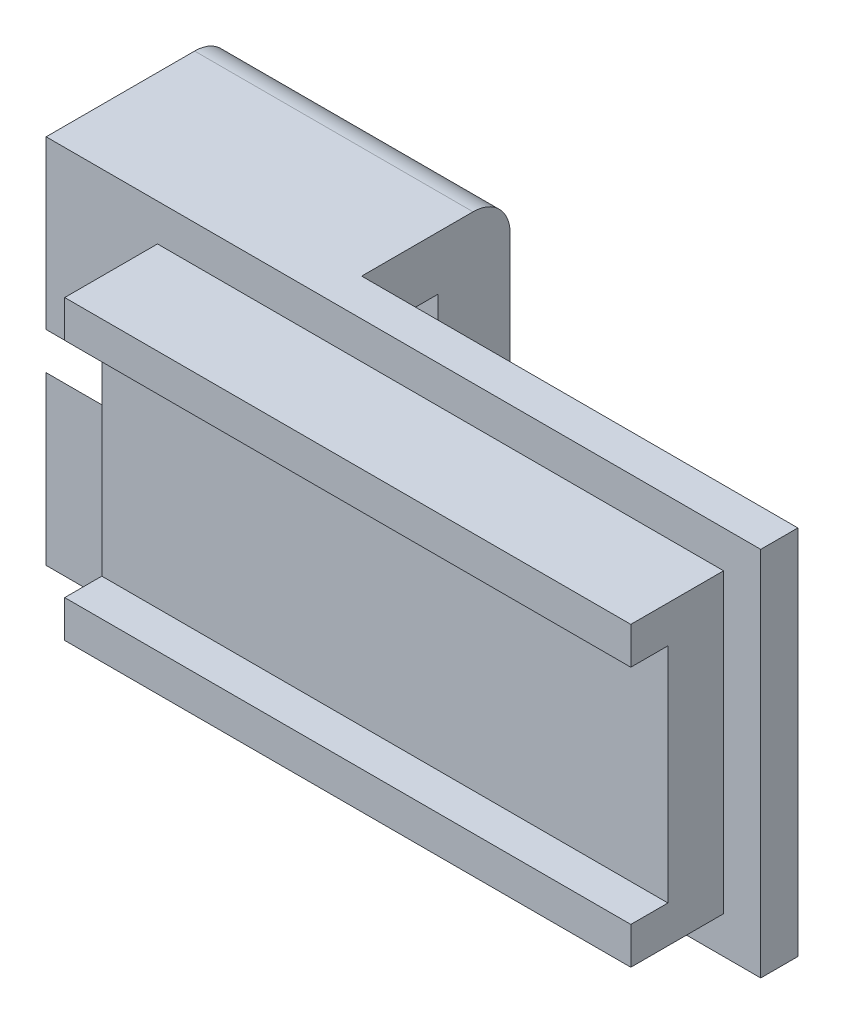
ISO-10303-21;
HEADER;
FILE_DESCRIPTION(('STEP AP214'),'2;1');
FILE_NAME('part.step','',(''),(''),'','','');
FILE_SCHEMA(('AUTOMOTIVE_DESIGN { 1 0 10303 214 1 1 1 1 }'));
ENDSEC;
DATA;
#1=APPLICATION_CONTEXT('core data for automotive mechanical design processes');
#2=APPLICATION_PROTOCOL_DEFINITION('international standard','automotive_design',2000,#1);
#3=PRODUCT_CONTEXT('',#1,'mechanical');
#4=PRODUCT('Part','Part','',(#3));
#5=PRODUCT_RELATED_PRODUCT_CATEGORY('part','',(#4));
#6=PRODUCT_DEFINITION_FORMATION('','',#4);
#7=PRODUCT_DEFINITION_CONTEXT('part definition',#1,'design');
#8=PRODUCT_DEFINITION('design','',#6,#7);
#9=PRODUCT_DEFINITION_SHAPE('','',#8);
#10=(LENGTH_UNIT() NAMED_UNIT(*) SI_UNIT(.MILLI.,.METRE.));
#11=(NAMED_UNIT(*) PLANE_ANGLE_UNIT() SI_UNIT($,.RADIAN.));
#12=(NAMED_UNIT(*) SI_UNIT($,.STERADIAN.) SOLID_ANGLE_UNIT());
#13=UNCERTAINTY_MEASURE_WITH_UNIT(LENGTH_MEASURE(1.E-05),#10,'distance_accuracy_value','');
#14=(GEOMETRIC_REPRESENTATION_CONTEXT(3) GLOBAL_UNCERTAINTY_ASSIGNED_CONTEXT((#13)) GLOBAL_UNIT_ASSIGNED_CONTEXT((#10,
#11,#12)) REPRESENTATION_CONTEXT('',''));
#15=CARTESIAN_POINT('',(0.,0.,0.));
#16=DIRECTION('',(0.,0.,1.));
#17=DIRECTION('',(1.,0.,0.));
#18=AXIS2_PLACEMENT_3D('',#15,#16,#17);
#19=CARTESIAN_POINT('',(0.,0.,7.99999999999998));
#20=DIRECTION('',(0.,0.,1.));
#21=DIRECTION('',(1.,0.,0.));
#22=AXIS2_PLACEMENT_3D('',#19,#20,#21);
#23=PLANE('',#22);
#24=DIRECTION('',(0.,-1.,0.));
#25=VECTOR('',#24,1.);
#26=CARTESIAN_POINT('',(6.,-8.,7.99999999999998));
#27=LINE('',#26,#25);
#28=CARTESIAN_POINT('',(6.,6.,7.99999999999998));
#29=VERTEX_POINT('',#28);
#30=CARTESIAN_POINT('',(6.,-6.,7.99999999999998));
#31=VERTEX_POINT('',#30);
#32=EDGE_CURVE('E428',#29,#31,#27,.T.);
#33=ORIENTED_EDGE('',*,*,#32,.T.);
#34=DIRECTION('',(1.,0.,0.));
#35=VECTOR('',#34,1.);
#36=CARTESIAN_POINT('',(6.,-6.,7.99999999999998));
#37=LINE('',#36,#35);
#38=CARTESIAN_POINT('',(36.5,-6.,7.99999999999998));
#39=VERTEX_POINT('',#38);
#40=EDGE_CURVE('E255',#31,#39,#37,.T.);
#41=ORIENTED_EDGE('',*,*,#40,.T.);
#42=DIRECTION('',(0.,1.,0.));
#43=VECTOR('',#42,1.);
#44=CARTESIAN_POINT('',(36.5,-7.99999999999999,7.99999999999998));
#45=LINE('',#44,#43);
#46=CARTESIAN_POINT('',(36.5,6.,7.99999999999998));
#47=VERTEX_POINT('',#46);
#48=EDGE_CURVE('E248',#39,#47,#45,.T.);
#49=ORIENTED_EDGE('',*,*,#48,.T.);
#50=DIRECTION('',(1.,0.,0.));
#51=VECTOR('',#50,1.);
#52=CARTESIAN_POINT('',(6.,6.,7.99999999999998));
#53=LINE('',#52,#51);
#54=EDGE_CURVE('E61',#29,#47,#53,.T.);
#55=ORIENTED_EDGE('',*,*,#54,.F.);
#56=EDGE_LOOP('',(#33,#41,#49,#55));
#57=FACE_BOUND('',#56,.T.);
#58=ADVANCED_FACE('F45',(#57),#23,.T.);
#59=CARTESIAN_POINT('',(38.5,0.,0.));
#60=DIRECTION('',(1.,0.,0.));
#61=DIRECTION('',(0.,0.,-1.));
#62=AXIS2_PLACEMENT_3D('',#59,#60,#61);
#63=PLANE('',#62);
#64=DIRECTION('',(0.,0.,-1.));
#65=VECTOR('',#64,1.);
#66=CARTESIAN_POINT('',(38.5,-10.,5.));
#67=LINE('',#66,#65);
#68=CARTESIAN_POINT('',(38.5,-10.,5.));
#69=VERTEX_POINT('',#68);
#70=CARTESIAN_POINT('',(38.5,-9.99999999999999,3.));
#71=VERTEX_POINT('',#70);
#72=EDGE_CURVE('E454',#69,#71,#67,.T.);
#73=ORIENTED_EDGE('',*,*,#72,.T.);
#74=DIRECTION('',(0.,-1.,0.));
#75=VECTOR('',#74,1.);
#76=CARTESIAN_POINT('',(38.5,-9.99999999999999,3.));
#77=LINE('',#76,#75);
#78=CARTESIAN_POINT('',(38.5,10.,3.));
#79=VERTEX_POINT('',#78);
#80=EDGE_CURVE('E385',#79,#71,#77,.T.);
#81=ORIENTED_EDGE('',*,*,#80,.F.);
#82=DIRECTION('',(0.,0.,1.));
#83=VECTOR('',#82,1.);
#84=CARTESIAN_POINT('',(38.5,10.,5.));
#85=LINE('',#84,#83);
#86=CARTESIAN_POINT('',(38.5,10.,5.));
#87=VERTEX_POINT('',#86);
#88=EDGE_CURVE('E447',#79,#87,#85,.T.);
#89=ORIENTED_EDGE('',*,*,#88,.T.);
#90=DIRECTION('',(0.,-1.,0.));
#91=VECTOR('',#90,1.);
#92=CARTESIAN_POINT('',(38.5,-10.,5.));
#93=LINE('',#92,#91);
#94=EDGE_CURVE('E450',#87,#69,#93,.T.);
#95=ORIENTED_EDGE('',*,*,#94,.T.);
#96=EDGE_LOOP('',(#73,#81,#89,#95));
#97=FACE_BOUND('',#96,.T.);
#98=ADVANCED_FACE('F549',(#97),#63,.T.);
#99=CARTESIAN_POINT('',(38.5,-10.,5.));
#100=DIRECTION('',(0.,0.,-1.));
#101=DIRECTION('',(-1.,0.,0.));
#102=AXIS2_PLACEMENT_3D('',#99,#100,#101);
#103=PLANE('',#102);
#104=DIRECTION('',(-1.,0.,0.));
#105=VECTOR('',#104,1.);
#106=CARTESIAN_POINT('',(9.99999999999998,-1.00498756211208,5.));
#107=LINE('',#106,#105);
#108=CARTESIAN_POINT('',(0.,-1.00498756211208,5.));
#109=VERTEX_POINT('',#108);
#110=CARTESIAN_POINT('',(6.,-1.00498756211208,5.));
#111=VERTEX_POINT('',#110);
#112=EDGE_CURVE('E416',#109,#111,#107,.F.);
#113=ORIENTED_EDGE('',*,*,#112,.F.);
#114=DIRECTION('',(0.,-1.,0.));
#115=VECTOR('',#114,1.);
#116=CARTESIAN_POINT('',(0.,-10.,5.));
#117=LINE('',#116,#115);
#118=CARTESIAN_POINT('',(0.,-10.,5.));
#119=VERTEX_POINT('',#118);
#120=EDGE_CURVE('E461',#109,#119,#117,.T.);
#121=ORIENTED_EDGE('',*,*,#120,.T.);
#122=DIRECTION('',(-1.,0.,0.));
#123=VECTOR('',#122,1.);
#124=CARTESIAN_POINT('',(38.5,-10.,5.));
#125=LINE('',#124,#123);
#126=EDGE_CURVE('E458',#69,#119,#125,.T.);
#127=ORIENTED_EDGE('',*,*,#126,.F.);
#128=ORIENTED_EDGE('',*,*,#94,.F.);
#129=DIRECTION('',(-1.,0.,0.));
#130=VECTOR('',#129,1.);
#131=CARTESIAN_POINT('',(38.5,10.,5.));
#132=LINE('',#131,#130);
#133=CARTESIAN_POINT('',(0.,10.,5.));
#134=VERTEX_POINT('',#133);
#135=EDGE_CURVE('E476',#87,#134,#132,.T.);
#136=ORIENTED_EDGE('',*,*,#135,.T.);
#137=CARTESIAN_POINT('',(0.,1.00498756211208,5.));
#138=VERTEX_POINT('',#137);
#139=EDGE_CURVE('E462',#134,#138,#117,.T.);
#140=ORIENTED_EDGE('',*,*,#139,.T.);
#141=DIRECTION('',(-1.,0.,0.));
#142=VECTOR('',#141,1.);
#143=CARTESIAN_POINT('',(9.99999999999998,1.00498756211208,5.));
#144=LINE('',#143,#142);
#145=CARTESIAN_POINT('',(6.,1.00498756211208,5.));
#146=VERTEX_POINT('',#145);
#147=EDGE_CURVE('E409',#146,#138,#144,.T.);
#148=ORIENTED_EDGE('',*,*,#147,.F.);
#149=DIRECTION('',(0.,-1.,0.));
#150=VECTOR('',#149,1.);
#151=CARTESIAN_POINT('',(6.,-10.,5.));
#152=LINE('',#151,#150);
#153=CARTESIAN_POINT('',(6.,8.,5.));
#154=VERTEX_POINT('',#153);
#155=EDGE_CURVE('E481',#154,#146,#152,.T.);
#156=ORIENTED_EDGE('',*,*,#155,.F.);
#157=DIRECTION('',(-1.,0.,0.));
#158=VECTOR('',#157,1.);
#159=CARTESIAN_POINT('',(38.5,8.00000000000001,5.));
#160=LINE('',#159,#158);
#161=CARTESIAN_POINT('',(36.5,8.00000000000001,5.));
#162=VERTEX_POINT('',#161);
#163=EDGE_CURVE('E485',#162,#154,#160,.T.);
#164=ORIENTED_EDGE('',*,*,#163,.F.);
#165=DIRECTION('',(0.,1.,0.));
#166=VECTOR('',#165,1.);
#167=CARTESIAN_POINT('',(36.5,-10.,5.));
#168=LINE('',#167,#166);
#169=CARTESIAN_POINT('',(36.5,-7.99999999999999,5.));
#170=VERTEX_POINT('',#169);
#171=EDGE_CURVE('E489',#170,#162,#168,.T.);
#172=ORIENTED_EDGE('',*,*,#171,.F.);
#173=DIRECTION('',(1.,0.,0.));
#174=VECTOR('',#173,1.);
#175=CARTESIAN_POINT('',(38.5,-7.99999999999999,5.));
#176=LINE('',#175,#174);
#177=CARTESIAN_POINT('',(6.,-8.,5.));
#178=VERTEX_POINT('',#177);
#179=EDGE_CURVE('E493',#178,#170,#176,.T.);
#180=ORIENTED_EDGE('',*,*,#179,.F.);
#181=EDGE_CURVE('E480',#111,#178,#152,.T.);
#182=ORIENTED_EDGE('',*,*,#181,.F.);
#183=EDGE_LOOP('',(#113,#121,#127,#128,#136,#140,#148,#156,#164,#172,#180,#182));
#184=FACE_BOUND('',#183,.T.);
#185=ADVANCED_FACE('F582',(#184),#103,.F.);
#186=CARTESIAN_POINT('',(38.5,-9.99999999999999,-5.));
#187=DIRECTION('',(0.,0.,1.));
#188=DIRECTION('',(1.,0.,0.));
#189=AXIS2_PLACEMENT_3D('',#186,#187,#188);
#190=PLANE('',#189);
#191=DIRECTION('',(-1.,0.,0.));
#192=VECTOR('',#191,1.);
#193=CARTESIAN_POINT('',(38.5,8.,-5.));
#194=LINE('',#193,#192);
#195=CARTESIAN_POINT('',(0.,8.,-5.));
#196=VERTEX_POINT('',#195);
#197=CARTESIAN_POINT('',(15.,8.,-5.));
#198=VERTEX_POINT('',#197);
#199=EDGE_CURVE('E504',#196,#198,#194,.F.);
#200=ORIENTED_EDGE('',*,*,#199,.T.);
#201=DIRECTION('',(0.,1.,0.));
#202=VECTOR('',#201,1.);
#203=CARTESIAN_POINT('',(15.,-9.99999999999999,-5.));
#204=LINE('',#203,#202);
#205=CARTESIAN_POINT('',(15.,-7.99999999999999,-5.));
#206=VERTEX_POINT('',#205);
#207=EDGE_CURVE('E326',#206,#198,#204,.T.);
#208=ORIENTED_EDGE('',*,*,#207,.F.);
#209=DIRECTION('',(-1.,0.,0.));
#210=VECTOR('',#209,1.);
#211=CARTESIAN_POINT('',(38.5,-7.99999999999999,-5.));
#212=LINE('',#211,#210);
#213=CARTESIAN_POINT('',(0.,-7.99999999999999,-5.));
#214=VERTEX_POINT('',#213);
#215=EDGE_CURVE('E508',#206,#214,#212,.T.);
#216=ORIENTED_EDGE('',*,*,#215,.T.);
#217=DIRECTION('',(0.,1.,0.));
#218=VECTOR('',#217,1.);
#219=CARTESIAN_POINT('',(0.,-9.99999999999999,-5.));
#220=LINE('',#219,#218);
#221=CARTESIAN_POINT('',(0.,-1.00498756211209,-5.));
#222=VERTEX_POINT('',#221);
#223=EDGE_CURVE('E451',#214,#222,#220,.T.);
#224=ORIENTED_EDGE('',*,*,#223,.T.);
#225=DIRECTION('',(-1.,0.,0.));
#226=VECTOR('',#225,1.);
#227=CARTESIAN_POINT('',(9.99999999999998,-1.00498756211209,-5.));
#228=LINE('',#227,#226);
#229=CARTESIAN_POINT('',(9.99999999999998,-1.00498756211209,-5.));
#230=VERTEX_POINT('',#229);
#231=EDGE_CURVE('E419',#230,#222,#228,.T.);
#232=ORIENTED_EDGE('',*,*,#231,.F.);
#233=DIRECTION('',(0.,1.,0.));
#234=VECTOR('',#233,1.);
#235=CARTESIAN_POINT('',(9.99999999999998,-9.99999999999999,-5.));
#236=LINE('',#235,#234);
#237=CARTESIAN_POINT('',(9.99999999999998,1.00498756211209,-5.));
#238=VERTEX_POINT('',#237);
#239=EDGE_CURVE('E500',#230,#238,#236,.T.);
#240=ORIENTED_EDGE('',*,*,#239,.T.);
#241=DIRECTION('',(-1.,0.,0.));
#242=VECTOR('',#241,1.);
#243=CARTESIAN_POINT('',(9.99999999999998,1.00498756211209,-5.));
#244=LINE('',#243,#242);
#245=CARTESIAN_POINT('',(0.,1.00498756211209,-5.));
#246=VERTEX_POINT('',#245);
#247=EDGE_CURVE('E423',#246,#238,#244,.F.);
#248=ORIENTED_EDGE('',*,*,#247,.F.);
#249=EDGE_CURVE('E470',#246,#196,#220,.T.);
#250=ORIENTED_EDGE('',*,*,#249,.T.);
#251=EDGE_LOOP('',(#200,#208,#216,#224,#232,#240,#248,#250));
#252=FACE_BOUND('',#251,.T.);
#253=ADVANCED_FACE('F533',(#252),#190,.F.);
#254=CARTESIAN_POINT('',(0.,0.,0.));
#255=DIRECTION('',(1.,0.,0.));
#256=DIRECTION('',(0.,0.,-1.));
#257=AXIS2_PLACEMENT_3D('',#254,#255,#256);
#258=PLANE('',#257);
#259=ORIENTED_EDGE('',*,*,#223,.F.);
#260=CARTESIAN_POINT('',(0.,-7.99999999999999,-3.));
#261=DIRECTION('',(1.,0.,0.));
#262=DIRECTION('',(0.,0.,-1.));
#263=AXIS2_PLACEMENT_3D('',#260,#261,#262);
#264=CIRCLE('',#263,2.);
#265=CARTESIAN_POINT('',(0.,-9.99999999999999,-3.));
#266=VERTEX_POINT('',#265);
#267=EDGE_CURVE('E511',#214,#266,#264,.F.);
#268=ORIENTED_EDGE('',*,*,#267,.T.);
#269=DIRECTION('',(0.,0.,-1.));
#270=VECTOR('',#269,1.);
#271=CARTESIAN_POINT('',(0.,-10.,5.));
#272=LINE('',#271,#270);
#273=EDGE_CURVE('E466',#119,#266,#272,.T.);
#274=ORIENTED_EDGE('',*,*,#273,.F.);
#275=ORIENTED_EDGE('',*,*,#120,.F.);
#276=CARTESIAN_POINT('',(0.,0.,0.));
#277=DIRECTION('',(1.,0.,0.));
#278=DIRECTION('',(0.,0.,-1.));
#279=AXIS2_PLACEMENT_3D('',#276,#277,#278);
#280=CIRCLE('',#279,5.1);
#281=EDGE_CURVE('E404',#109,#222,#280,.T.);
#282=ORIENTED_EDGE('',*,*,#281,.T.);
#283=EDGE_LOOP('',(#259,#268,#274,#275,#282));
#284=FACE_BOUND('',#283,.T.);
#285=ADVANCED_FACE('F572',(#284),#258,.F.);
#286=CARTESIAN_POINT('',(38.5,10.,5.));
#287=DIRECTION('',(0.,-1.,0.));
#288=DIRECTION('',(0.,0.,-1.));
#289=AXIS2_PLACEMENT_3D('',#286,#287,#288);
#290=PLANE('',#289);
#291=DIRECTION('',(1.,0.,0.));
#292=VECTOR('',#291,1.);
#293=CARTESIAN_POINT('',(15.,10.,3.));
#294=LINE('',#293,#292);
#295=CARTESIAN_POINT('',(15.,10.,3.));
#296=VERTEX_POINT('',#295);
#297=EDGE_CURVE('E382',#296,#79,#294,.T.);
#298=ORIENTED_EDGE('',*,*,#297,.F.);
#299=DIRECTION('',(0.,0.,-1.));
#300=VECTOR('',#299,1.);
#301=CARTESIAN_POINT('',(15.,10.,3.));
#302=LINE('',#301,#300);
#303=CARTESIAN_POINT('',(15.,10.,-3.));
#304=VERTEX_POINT('',#303);
#305=EDGE_CURVE('E392',#296,#304,#302,.T.);
#306=ORIENTED_EDGE('',*,*,#305,.T.);
#307=DIRECTION('',(-1.,0.,0.));
#308=VECTOR('',#307,1.);
#309=CARTESIAN_POINT('',(38.5,10.,-3.));
#310=LINE('',#309,#308);
#311=CARTESIAN_POINT('',(0.,10.,-3.));
#312=VERTEX_POINT('',#311);
#313=EDGE_CURVE('E518',#304,#312,#310,.T.);
#314=ORIENTED_EDGE('',*,*,#313,.T.);
#315=DIRECTION('',(0.,0.,1.));
#316=VECTOR('',#315,1.);
#317=CARTESIAN_POINT('',(0.,10.,5.));
#318=LINE('',#317,#316);
#319=EDGE_CURVE('E446',#312,#134,#318,.T.);
#320=ORIENTED_EDGE('',*,*,#319,.T.);
#321=ORIENTED_EDGE('',*,*,#135,.F.);
#322=ORIENTED_EDGE('',*,*,#88,.F.);
#323=EDGE_LOOP('',(#298,#306,#314,#320,#321,#322));
#324=FACE_BOUND('',#323,.T.);
#325=ADVANCED_FACE('F541',(#324),#290,.F.);
#326=CARTESIAN_POINT('',(38.5,-10.,5.));
#327=DIRECTION('',(0.,1.,0.));
#328=DIRECTION('',(0.,0.,1.));
#329=AXIS2_PLACEMENT_3D('',#326,#327,#328);
#330=PLANE('',#329);
#331=DIRECTION('',(-1.,0.,0.));
#332=VECTOR('',#331,1.);
#333=CARTESIAN_POINT('',(38.5,-9.99999999999999,-3.));
#334=LINE('',#333,#332);
#335=CARTESIAN_POINT('',(15.,-9.99999999999999,-3.));
#336=VERTEX_POINT('',#335);
#337=EDGE_CURVE('E514',#266,#336,#334,.F.);
#338=ORIENTED_EDGE('',*,*,#337,.T.);
#339=DIRECTION('',(0.,0.,-1.));
#340=VECTOR('',#339,1.);
#341=CARTESIAN_POINT('',(15.,-9.99999999999999,3.));
#342=LINE('',#341,#340);
#343=CARTESIAN_POINT('',(15.,-9.99999999999999,3.));
#344=VERTEX_POINT('',#343);
#345=EDGE_CURVE('E395',#344,#336,#342,.T.);
#346=ORIENTED_EDGE('',*,*,#345,.F.);
#347=DIRECTION('',(-1.,0.,0.));
#348=VECTOR('',#347,1.);
#349=CARTESIAN_POINT('',(15.,-9.99999999999999,3.));
#350=LINE('',#349,#348);
#351=EDGE_CURVE('E388',#71,#344,#350,.T.);
#352=ORIENTED_EDGE('',*,*,#351,.F.);
#353=ORIENTED_EDGE('',*,*,#72,.F.);
#354=ORIENTED_EDGE('',*,*,#126,.T.);
#355=ORIENTED_EDGE('',*,*,#273,.T.);
#356=EDGE_LOOP('',(#338,#346,#352,#353,#354,#355));
#357=FACE_BOUND('',#356,.T.);
#358=ADVANCED_FACE('F554',(#357),#330,.F.);
#359=ORIENTED_EDGE('',*,*,#319,.F.);
#360=CARTESIAN_POINT('',(0.,8.,-3.));
#361=DIRECTION('',(1.,0.,0.));
#362=DIRECTION('',(0.,0.,-1.));
#363=AXIS2_PLACEMENT_3D('',#360,#361,#362);
#364=CIRCLE('',#363,2.);
#365=EDGE_CURVE('E54',#312,#196,#364,.F.);
#366=ORIENTED_EDGE('',*,*,#365,.T.);
#367=ORIENTED_EDGE('',*,*,#249,.F.);
#368=EDGE_CURVE('E410',#246,#138,#280,.T.);
#369=ORIENTED_EDGE('',*,*,#368,.T.);
#370=ORIENTED_EDGE('',*,*,#139,.F.);
#371=EDGE_LOOP('',(#359,#366,#367,#369,#370));
#372=FACE_BOUND('',#371,.T.);
#373=ADVANCED_FACE('F526',(#372),#258,.F.);
#374=CARTESIAN_POINT('',(6.,-8.,7.99999999999998));
#375=DIRECTION('',(0.,1.,0.));
#376=DIRECTION('',(-1.,0.,0.));
#377=AXIS2_PLACEMENT_3D('',#374,#375,#376);
#378=PLANE('',#377);
#379=DIRECTION('',(0.,0.,-1.));
#380=VECTOR('',#379,1.);
#381=CARTESIAN_POINT('',(6.,-8.,7.99999999999998));
#382=LINE('',#381,#380);
#383=CARTESIAN_POINT('',(6.,-8.,9.99999999999998));
#384=VERTEX_POINT('',#383);
#385=EDGE_CURVE('E431',#384,#178,#382,.T.);
#386=ORIENTED_EDGE('',*,*,#385,.T.);
#387=ORIENTED_EDGE('',*,*,#179,.T.);
#388=DIRECTION('',(0.,0.,-1.));
#389=VECTOR('',#388,1.);
#390=CARTESIAN_POINT('',(36.5,-7.99999999999999,7.99999999999998));
#391=LINE('',#390,#389);
#392=CARTESIAN_POINT('',(36.5,-8.,9.99999999999998));
#393=VERTEX_POINT('',#392);
#394=EDGE_CURVE('E443',#393,#170,#391,.T.);
#395=ORIENTED_EDGE('',*,*,#394,.F.);
#396=DIRECTION('',(1.,0.,0.));
#397=VECTOR('',#396,1.);
#398=CARTESIAN_POINT('',(6.,-8.,9.99999999999998));
#399=LINE('',#398,#397);
#400=EDGE_CURVE('E240',#384,#393,#399,.T.);
#401=ORIENTED_EDGE('',*,*,#400,.F.);
#402=EDGE_LOOP('',(#386,#387,#395,#401));
#403=FACE_BOUND('',#402,.T.);
#404=ADVANCED_FACE('F584',(#403),#378,.F.);
#405=CARTESIAN_POINT('',(36.5,-7.99999999999999,7.99999999999998));
#406=DIRECTION('',(-1.,0.,0.));
#407=DIRECTION('',(0.,0.,1.));
#408=AXIS2_PLACEMENT_3D('',#405,#406,#407);
#409=PLANE('',#408);
#410=ORIENTED_EDGE('',*,*,#394,.T.);
#411=ORIENTED_EDGE('',*,*,#171,.T.);
#412=DIRECTION('',(0.,0.,-1.));
#413=VECTOR('',#412,1.);
#414=CARTESIAN_POINT('',(36.5,8.00000000000001,7.99999999999998));
#415=LINE('',#414,#413);
#416=CARTESIAN_POINT('',(36.5,8.,9.99999999999998));
#417=VERTEX_POINT('',#416);
#418=EDGE_CURVE('E439',#417,#162,#415,.T.);
#419=ORIENTED_EDGE('',*,*,#418,.F.);
#420=DIRECTION('',(0.,-1.,0.));
#421=VECTOR('',#420,1.);
#422=CARTESIAN_POINT('',(36.5,8.,9.99999999999998));
#423=LINE('',#422,#421);
#424=CARTESIAN_POINT('',(36.5,6.,9.99999999999998));
#425=VERTEX_POINT('',#424);
#426=EDGE_CURVE('E284',#417,#425,#423,.T.);
#427=ORIENTED_EDGE('',*,*,#426,.T.);
#428=DIRECTION('',(0.,0.,-1.));
#429=VECTOR('',#428,1.);
#430=CARTESIAN_POINT('',(36.5,6.,9.99999999999998));
#431=LINE('',#430,#429);
#432=EDGE_CURVE('E267',#425,#47,#431,.T.);
#433=ORIENTED_EDGE('',*,*,#432,.T.);
#434=ORIENTED_EDGE('',*,*,#48,.F.);
#435=DIRECTION('',(0.,0.,-1.));
#436=VECTOR('',#435,1.);
#437=CARTESIAN_POINT('',(36.5,-6.,9.99999999999998));
#438=LINE('',#437,#436);
#439=CARTESIAN_POINT('',(36.5,-6.,9.99999999999998));
#440=VERTEX_POINT('',#439);
#441=EDGE_CURVE('E69',#440,#39,#438,.T.);
#442=ORIENTED_EDGE('',*,*,#441,.F.);
#443=DIRECTION('',(0.,1.,0.));
#444=VECTOR('',#443,1.);
#445=CARTESIAN_POINT('',(36.5,-8.,9.99999999999998));
#446=LINE('',#445,#444);
#447=EDGE_CURVE('E234',#393,#440,#446,.T.);
#448=ORIENTED_EDGE('',*,*,#447,.F.);
#449=EDGE_LOOP('',(#410,#411,#419,#427,#433,#434,#442,#448));
#450=FACE_BOUND('',#449,.T.);
#451=ADVANCED_FACE('F246',(#450),#409,.F.);
#452=CARTESIAN_POINT('',(6.,8.,7.99999999999998));
#453=DIRECTION('',(0.,-1.,0.));
#454=DIRECTION('',(1.,0.,0.));
#455=AXIS2_PLACEMENT_3D('',#452,#453,#454);
#456=PLANE('',#455);
#457=ORIENTED_EDGE('',*,*,#418,.T.);
#458=ORIENTED_EDGE('',*,*,#163,.T.);
#459=DIRECTION('',(0.,0.,-1.));
#460=VECTOR('',#459,1.);
#461=CARTESIAN_POINT('',(6.,8.,7.99999999999998));
#462=LINE('',#461,#460);
#463=CARTESIAN_POINT('',(6.,8.,9.99999999999998));
#464=VERTEX_POINT('',#463);
#465=EDGE_CURVE('E435',#464,#154,#462,.T.);
#466=ORIENTED_EDGE('',*,*,#465,.F.);
#467=DIRECTION('',(1.,0.,0.));
#468=VECTOR('',#467,1.);
#469=CARTESIAN_POINT('',(6.,8.,9.99999999999998));
#470=LINE('',#469,#468);
#471=EDGE_CURVE('E280',#464,#417,#470,.T.);
#472=ORIENTED_EDGE('',*,*,#471,.T.);
#473=EDGE_LOOP('',(#457,#458,#466,#472));
#474=FACE_BOUND('',#473,.T.);
#475=ADVANCED_FACE('F600',(#474),#456,.F.);
#476=CARTESIAN_POINT('',(6.,-8.,7.99999999999998));
#477=DIRECTION('',(1.,0.,0.));
#478=DIRECTION('',(0.,0.,-1.));
#479=AXIS2_PLACEMENT_3D('',#476,#477,#478);
#480=PLANE('',#479);
#481=CARTESIAN_POINT('',(6.,0.,0.));
#482=DIRECTION('',(1.,0.,0.));
#483=DIRECTION('',(0.,0.,-1.));
#484=AXIS2_PLACEMENT_3D('',#481,#482,#483);
#485=CIRCLE('',#484,5.1);
#486=EDGE_CURVE('E497',#111,#146,#485,.F.);
#487=ORIENTED_EDGE('',*,*,#486,.F.);
#488=ORIENTED_EDGE('',*,*,#181,.T.);
#489=ORIENTED_EDGE('',*,*,#385,.F.);
#490=DIRECTION('',(0.,1.,0.));
#491=VECTOR('',#490,1.);
#492=CARTESIAN_POINT('',(6.,-8.,9.99999999999998));
#493=LINE('',#492,#491);
#494=CARTESIAN_POINT('',(6.,-6.,9.99999999999998));
#495=VERTEX_POINT('',#494);
#496=EDGE_CURVE('E251',#384,#495,#493,.T.);
#497=ORIENTED_EDGE('',*,*,#496,.T.);
#498=DIRECTION('',(0.,0.,-1.));
#499=VECTOR('',#498,1.);
#500=CARTESIAN_POINT('',(6.,-6.,9.99999999999998));
#501=LINE('',#500,#499);
#502=EDGE_CURVE('E250',#495,#31,#501,.T.);
#503=ORIENTED_EDGE('',*,*,#502,.T.);
#504=ORIENTED_EDGE('',*,*,#32,.F.);
#505=DIRECTION('',(0.,0.,-1.));
#506=VECTOR('',#505,1.);
#507=CARTESIAN_POINT('',(6.,6.,9.99999999999998));
#508=LINE('',#507,#506);
#509=CARTESIAN_POINT('',(6.,6.,9.99999999999998));
#510=VERTEX_POINT('',#509);
#511=EDGE_CURVE('E270',#510,#29,#508,.T.);
#512=ORIENTED_EDGE('',*,*,#511,.F.);
#513=DIRECTION('',(0.,-1.,0.));
#514=VECTOR('',#513,1.);
#515=CARTESIAN_POINT('',(6.,8.,9.99999999999998));
#516=LINE('',#515,#514);
#517=EDGE_CURVE('E274',#464,#510,#516,.T.);
#518=ORIENTED_EDGE('',*,*,#517,.F.);
#519=ORIENTED_EDGE('',*,*,#465,.T.);
#520=ORIENTED_EDGE('',*,*,#155,.T.);
#521=EDGE_LOOP('',(#487,#488,#489,#497,#503,#504,#512,#518,#519,#520));
#522=FACE_BOUND('',#521,.T.);
#523=ADVANCED_FACE('F580',(#522),#480,.F.);
#524=CARTESIAN_POINT('',(9.99999999999998,0.,0.));
#525=DIRECTION('',(1.,0.,0.));
#526=DIRECTION('',(0.,0.,-1.));
#527=AXIS2_PLACEMENT_3D('',#524,#525,#526);
#528=PLANE('',#527);
#529=CARTESIAN_POINT('',(9.99999999999998,0.,0.));
#530=DIRECTION('',(1.,0.,0.));
#531=DIRECTION('',(0.,0.,-1.));
#532=AXIS2_PLACEMENT_3D('',#529,#530,#531);
#533=CIRCLE('',#532,5.1);
#534=EDGE_CURVE('E405',#238,#230,#533,.T.);
#535=ORIENTED_EDGE('',*,*,#534,.F.);
#536=ORIENTED_EDGE('',*,*,#239,.F.);
#537=EDGE_LOOP('',(#535,#536));
#538=FACE_BOUND('',#537,.T.);
#539=ADVANCED_FACE('F599',(#538),#528,.F.);
#540=CARTESIAN_POINT('',(9.99999999999998,0.,0.));
#541=DIRECTION('',(-1.,0.,0.));
#542=DIRECTION('',(0.,0.,1.));
#543=AXIS2_PLACEMENT_3D('',#540,#541,#542);
#544=CYLINDRICAL_SURFACE('',#543,5.1);
#545=ORIENTED_EDGE('',*,*,#247,.T.);
#546=ORIENTED_EDGE('',*,*,#534,.T.);
#547=ORIENTED_EDGE('',*,*,#231,.T.);
#548=ORIENTED_EDGE('',*,*,#281,.F.);
#549=ORIENTED_EDGE('',*,*,#112,.T.);
#550=ORIENTED_EDGE('',*,*,#486,.T.);
#551=ORIENTED_EDGE('',*,*,#147,.T.);
#552=ORIENTED_EDGE('',*,*,#368,.F.);
#553=EDGE_LOOP('',(#545,#546,#547,#548,#549,#550,#551,#552));
#554=FACE_BOUND('',#553,.T.);
#555=ADVANCED_FACE('F568',(#554),#544,.F.);
#556=CARTESIAN_POINT('',(38.5,-7.99999999999999,-3.));
#557=DIRECTION('',(-1.,0.,0.));
#558=DIRECTION('',(0.,0.,1.));
#559=AXIS2_PLACEMENT_3D('',#556,#557,#558);
#560=CYLINDRICAL_SURFACE('',#559,2.);
#561=CARTESIAN_POINT('',(15.,-7.99999999999999,-3.));
#562=DIRECTION('',(-1.,0.,0.));
#563=DIRECTION('',(0.,-1.,0.));
#564=AXIS2_PLACEMENT_3D('',#561,#562,#563);
#565=CIRCLE('',#564,2.);
#566=EDGE_CURVE('E398',#336,#206,#565,.F.);
#567=ORIENTED_EDGE('',*,*,#566,.F.);
#568=ORIENTED_EDGE('',*,*,#337,.F.);
#569=ORIENTED_EDGE('',*,*,#267,.F.);
#570=ORIENTED_EDGE('',*,*,#215,.F.);
#571=EDGE_LOOP('',(#567,#568,#569,#570));
#572=FACE_BOUND('',#571,.T.);
#573=ADVANCED_FACE('F561',(#572),#560,.T.);
#574=CARTESIAN_POINT('',(38.5,8.,-3.));
#575=DIRECTION('',(-1.,0.,0.));
#576=DIRECTION('',(0.,0.,1.));
#577=AXIS2_PLACEMENT_3D('',#574,#575,#576);
#578=CYLINDRICAL_SURFACE('',#577,2.);
#579=CARTESIAN_POINT('',(15.,8.,-3.));
#580=DIRECTION('',(-1.,0.,0.));
#581=DIRECTION('',(0.,-1.,0.));
#582=AXIS2_PLACEMENT_3D('',#579,#580,#581);
#583=CIRCLE('',#582,2.);
#584=EDGE_CURVE('E11',#198,#304,#583,.F.);
#585=ORIENTED_EDGE('',*,*,#584,.F.);
#586=ORIENTED_EDGE('',*,*,#199,.F.);
#587=ORIENTED_EDGE('',*,*,#365,.F.);
#588=ORIENTED_EDGE('',*,*,#313,.F.);
#589=EDGE_LOOP('',(#585,#586,#587,#588));
#590=FACE_BOUND('',#589,.T.);
#591=ADVANCED_FACE('F47',(#590),#578,.T.);
#592=CARTESIAN_POINT('',(15.,-9.99999999999999,3.));
#593=DIRECTION('',(-1.,0.,0.));
#594=DIRECTION('',(0.,-1.,0.));
#595=AXIS2_PLACEMENT_3D('',#592,#593,#594);
#596=PLANE('',#595);
#597=DIRECTION('',(0.,-1.,0.));
#598=VECTOR('',#597,1.);
#599=CARTESIAN_POINT('',(15.,4.9,1.1));
#600=LINE('',#599,#598);
#601=CARTESIAN_POINT('',(15.,7.1,1.1));
#602=VERTEX_POINT('',#601);
#603=CARTESIAN_POINT('',(15.,4.9,1.1));
#604=VERTEX_POINT('',#603);
#605=EDGE_CURVE('E311',#602,#604,#600,.T.);
#606=ORIENTED_EDGE('',*,*,#605,.F.);
#607=DIRECTION('',(0.,0.,1.));
#608=VECTOR('',#607,1.);
#609=CARTESIAN_POINT('',(15.,7.1,1.1));
#610=LINE('',#609,#608);
#611=CARTESIAN_POINT('',(15.,7.1,-1.1));
#612=VERTEX_POINT('',#611);
#613=EDGE_CURVE('E308',#612,#602,#610,.T.);
#614=ORIENTED_EDGE('',*,*,#613,.F.);
#615=DIRECTION('',(0.,1.,0.));
#616=VECTOR('',#615,1.);
#617=CARTESIAN_POINT('',(15.,4.9,-1.1));
#618=LINE('',#617,#616);
#619=CARTESIAN_POINT('',(15.,4.9,-1.1));
#620=VERTEX_POINT('',#619);
#621=EDGE_CURVE('E295',#620,#612,#618,.T.);
#622=ORIENTED_EDGE('',*,*,#621,.F.);
#623=DIRECTION('',(0.,0.,-1.));
#624=VECTOR('',#623,1.);
#625=CARTESIAN_POINT('',(15.,4.9,1.1));
#626=LINE('',#625,#624);
#627=EDGE_CURVE('E316',#604,#620,#626,.T.);
#628=ORIENTED_EDGE('',*,*,#627,.F.);
#629=EDGE_LOOP('',(#606,#614,#622,#628));
#630=FACE_BOUND('',#629,.T.);
#631=DIRECTION('',(0.,-1.,0.));
#632=VECTOR('',#631,1.);
#633=CARTESIAN_POINT('',(15.,-4.9,1.1));
#634=LINE('',#633,#632);
#635=CARTESIAN_POINT('',(15.,-4.9,1.1));
#636=VERTEX_POINT('',#635);
#637=CARTESIAN_POINT('',(15.,-7.1,1.1));
#638=VERTEX_POINT('',#637);
#639=EDGE_CURVE('E358',#636,#638,#634,.T.);
#640=ORIENTED_EDGE('',*,*,#639,.F.);
#641=DIRECTION('',(0.,0.,1.));
#642=VECTOR('',#641,1.);
#643=CARTESIAN_POINT('',(15.,-4.9,1.1));
#644=LINE('',#643,#642);
#645=CARTESIAN_POINT('',(15.,-4.9,-1.1));
#646=VERTEX_POINT('',#645);
#647=EDGE_CURVE('E312',#646,#636,#644,.T.);
#648=ORIENTED_EDGE('',*,*,#647,.F.);
#649=DIRECTION('',(0.,1.,0.));
#650=VECTOR('',#649,1.);
#651=CARTESIAN_POINT('',(15.,-4.9,-1.1));
#652=LINE('',#651,#650);
#653=CARTESIAN_POINT('',(15.,-7.1,-1.1));
#654=VERTEX_POINT('',#653);
#655=EDGE_CURVE('E349',#654,#646,#652,.T.);
#656=ORIENTED_EDGE('',*,*,#655,.F.);
#657=DIRECTION('',(0.,0.,-1.));
#658=VECTOR('',#657,1.);
#659=CARTESIAN_POINT('',(15.,-7.1,1.1));
#660=LINE('',#659,#658);
#661=EDGE_CURVE('E353',#638,#654,#660,.T.);
#662=ORIENTED_EDGE('',*,*,#661,.F.);
#663=EDGE_LOOP('',(#640,#648,#656,#662));
#664=FACE_BOUND('',#663,.T.);
#665=ORIENTED_EDGE('',*,*,#566,.T.);
#666=ORIENTED_EDGE('',*,*,#207,.T.);
#667=ORIENTED_EDGE('',*,*,#584,.T.);
#668=ORIENTED_EDGE('',*,*,#305,.F.);
#669=DIRECTION('',(0.,1.,0.));
#670=VECTOR('',#669,1.);
#671=CARTESIAN_POINT('',(15.,-9.99999999999999,3.));
#672=LINE('',#671,#670);
#673=EDGE_CURVE('E378',#344,#296,#672,.T.);
#674=ORIENTED_EDGE('',*,*,#673,.F.);
#675=ORIENTED_EDGE('',*,*,#345,.T.);
#676=EDGE_LOOP('',(#665,#666,#667,#668,#674,#675));
#677=FACE_BOUND('',#676,.T.);
#678=ADVANCED_FACE('F538',(#630,#664,#677),#596,.F.);
#679=CARTESIAN_POINT('',(0.,0.,3.));
#680=DIRECTION('',(0.,0.,-1.));
#681=DIRECTION('',(-1.,0.,0.));
#682=AXIS2_PLACEMENT_3D('',#679,#680,#681);
#683=PLANE('',#682);
#684=ORIENTED_EDGE('',*,*,#673,.T.);
#685=ORIENTED_EDGE('',*,*,#297,.T.);
#686=ORIENTED_EDGE('',*,*,#80,.T.);
#687=ORIENTED_EDGE('',*,*,#351,.T.);
#688=EDGE_LOOP('',(#684,#685,#686,#687));
#689=FACE_BOUND('',#688,.T.);
#690=ADVANCED_FACE('F546',(#689),#683,.T.);
#691=CARTESIAN_POINT('',(12.,-4.9,1.1));
#692=DIRECTION('',(0.,1.,0.));
#693=DIRECTION('',(-1.,0.,0.));
#694=AXIS2_PLACEMENT_3D('',#691,#692,#693);
#695=PLANE('',#694);
#696=ORIENTED_EDGE('',*,*,#647,.T.);
#697=DIRECTION('',(1.,0.,0.));
#698=VECTOR('',#697,1.);
#699=CARTESIAN_POINT('',(12.,-4.9,1.1));
#700=LINE('',#699,#698);
#701=CARTESIAN_POINT('',(12.,-4.9,1.1));
#702=VERTEX_POINT('',#701);
#703=EDGE_CURVE('E336',#702,#636,#700,.T.);
#704=ORIENTED_EDGE('',*,*,#703,.F.);
#705=DIRECTION('',(0.,0.,1.));
#706=VECTOR('',#705,1.);
#707=CARTESIAN_POINT('',(12.,-4.9,1.1));
#708=LINE('',#707,#706);
#709=CARTESIAN_POINT('',(12.,-4.9,-1.1));
#710=VERTEX_POINT('',#709);
#711=EDGE_CURVE('E354',#710,#702,#708,.T.);
#712=ORIENTED_EDGE('',*,*,#711,.F.);
#713=DIRECTION('',(1.,0.,0.));
#714=VECTOR('',#713,1.);
#715=CARTESIAN_POINT('',(12.,-4.9,-1.1));
#716=LINE('',#715,#714);
#717=EDGE_CURVE('E265',#710,#646,#716,.T.);
#718=ORIENTED_EDGE('',*,*,#717,.T.);
#719=EDGE_LOOP('',(#696,#704,#712,#718));
#720=FACE_BOUND('',#719,.T.);
#721=ADVANCED_FACE('F634',(#720),#695,.F.);
#722=CARTESIAN_POINT('',(12.,-4.9,-1.1));
#723=DIRECTION('',(0.,0.,-1.));
#724=DIRECTION('',(-1.,0.,0.));
#725=AXIS2_PLACEMENT_3D('',#722,#723,#724);
#726=PLANE('',#725);
#727=ORIENTED_EDGE('',*,*,#655,.T.);
#728=ORIENTED_EDGE('',*,*,#717,.F.);
#729=DIRECTION('',(0.,1.,0.));
#730=VECTOR('',#729,1.);
#731=CARTESIAN_POINT('',(12.,-4.9,-1.1));
#732=LINE('',#731,#730);
#733=CARTESIAN_POINT('',(12.,-7.1,-1.1));
#734=VERTEX_POINT('',#733);
#735=EDGE_CURVE('E340',#734,#710,#732,.T.);
#736=ORIENTED_EDGE('',*,*,#735,.F.);
#737=DIRECTION('',(1.,0.,0.));
#738=VECTOR('',#737,1.);
#739=CARTESIAN_POINT('',(12.,-7.1,-1.1));
#740=LINE('',#739,#738);
#741=EDGE_CURVE('E344',#734,#654,#740,.T.);
#742=ORIENTED_EDGE('',*,*,#741,.T.);
#743=EDGE_LOOP('',(#727,#728,#736,#742));
#744=FACE_BOUND('',#743,.T.);
#745=ADVANCED_FACE('F641',(#744),#726,.F.);
#746=CARTESIAN_POINT('',(12.,-7.1,1.1));
#747=DIRECTION('',(0.,-1.,0.));
#748=DIRECTION('',(1.,0.,0.));
#749=AXIS2_PLACEMENT_3D('',#746,#747,#748);
#750=PLANE('',#749);
#751=ORIENTED_EDGE('',*,*,#661,.T.);
#752=ORIENTED_EDGE('',*,*,#741,.F.);
#753=DIRECTION('',(0.,0.,-1.));
#754=VECTOR('',#753,1.);
#755=CARTESIAN_POINT('',(12.,-7.1,1.1));
#756=LINE('',#755,#754);
#757=CARTESIAN_POINT('',(12.,-7.1,1.1));
#758=VERTEX_POINT('',#757);
#759=EDGE_CURVE('E367',#758,#734,#756,.T.);
#760=ORIENTED_EDGE('',*,*,#759,.F.);
#761=DIRECTION('',(1.,0.,0.));
#762=VECTOR('',#761,1.);
#763=CARTESIAN_POINT('',(12.,-7.1,1.1));
#764=LINE('',#763,#762);
#765=EDGE_CURVE('E341',#758,#638,#764,.T.);
#766=ORIENTED_EDGE('',*,*,#765,.T.);
#767=EDGE_LOOP('',(#751,#752,#760,#766));
#768=FACE_BOUND('',#767,.T.);
#769=ADVANCED_FACE('F644',(#768),#750,.F.);
#770=CARTESIAN_POINT('',(12.,-4.9,1.1));
#771=DIRECTION('',(0.,0.,1.));
#772=DIRECTION('',(1.,0.,0.));
#773=AXIS2_PLACEMENT_3D('',#770,#771,#772);
#774=PLANE('',#773);
#775=ORIENTED_EDGE('',*,*,#639,.T.);
#776=ORIENTED_EDGE('',*,*,#765,.F.);
#777=DIRECTION('',(0.,-1.,0.));
#778=VECTOR('',#777,1.);
#779=CARTESIAN_POINT('',(12.,-4.9,1.1));
#780=LINE('',#779,#778);
#781=EDGE_CURVE('E371',#702,#758,#780,.T.);
#782=ORIENTED_EDGE('',*,*,#781,.F.);
#783=ORIENTED_EDGE('',*,*,#703,.T.);
#784=EDGE_LOOP('',(#775,#776,#782,#783));
#785=FACE_BOUND('',#784,.T.);
#786=ADVANCED_FACE('F639',(#785),#774,.F.);
#787=CARTESIAN_POINT('',(12.,0.,0.));
#788=DIRECTION('',(-1.,0.,0.));
#789=DIRECTION('',(0.,0.,1.));
#790=AXIS2_PLACEMENT_3D('',#787,#788,#789);
#791=PLANE('',#790);
#792=ORIENTED_EDGE('',*,*,#711,.T.);
#793=ORIENTED_EDGE('',*,*,#781,.T.);
#794=ORIENTED_EDGE('',*,*,#759,.T.);
#795=ORIENTED_EDGE('',*,*,#735,.T.);
#796=EDGE_LOOP('',(#792,#793,#794,#795));
#797=FACE_BOUND('',#796,.T.);
#798=ADVANCED_FACE('F635',(#797),#791,.F.);
#799=CARTESIAN_POINT('',(12.,7.1,1.1));
#800=DIRECTION('',(0.,1.,0.));
#801=DIRECTION('',(-1.,0.,0.));
#802=AXIS2_PLACEMENT_3D('',#799,#800,#801);
#803=PLANE('',#802);
#804=ORIENTED_EDGE('',*,*,#613,.T.);
#805=DIRECTION('',(1.,0.,0.));
#806=VECTOR('',#805,1.);
#807=CARTESIAN_POINT('',(12.,7.1,1.1));
#808=LINE('',#807,#806);
#809=CARTESIAN_POINT('',(12.,7.1,1.1));
#810=VERTEX_POINT('',#809);
#811=EDGE_CURVE('E307',#810,#602,#808,.T.);
#812=ORIENTED_EDGE('',*,*,#811,.F.);
#813=DIRECTION('',(0.,0.,1.));
#814=VECTOR('',#813,1.);
#815=CARTESIAN_POINT('',(12.,7.1,1.1));
#816=LINE('',#815,#814);
#817=CARTESIAN_POINT('',(12.,7.1,-1.1));
#818=VERTEX_POINT('',#817);
#819=EDGE_CURVE('E290',#818,#810,#816,.T.);
#820=ORIENTED_EDGE('',*,*,#819,.F.);
#821=DIRECTION('',(1.,0.,0.));
#822=VECTOR('',#821,1.);
#823=CARTESIAN_POINT('',(12.,7.1,-1.1));
#824=LINE('',#823,#822);
#825=EDGE_CURVE('E323',#818,#612,#824,.T.);
#826=ORIENTED_EDGE('',*,*,#825,.T.);
#827=EDGE_LOOP('',(#804,#812,#820,#826));
#828=FACE_BOUND('',#827,.T.);
#829=ADVANCED_FACE('F638',(#828),#803,.F.);
#830=CARTESIAN_POINT('',(12.,4.9,-1.1));
#831=DIRECTION('',(0.,0.,-1.));
#832=DIRECTION('',(-1.,0.,0.));
#833=AXIS2_PLACEMENT_3D('',#830,#831,#832);
#834=PLANE('',#833);
#835=ORIENTED_EDGE('',*,*,#621,.T.);
#836=ORIENTED_EDGE('',*,*,#825,.F.);
#837=DIRECTION('',(0.,1.,0.));
#838=VECTOR('',#837,1.);
#839=CARTESIAN_POINT('',(12.,4.9,-1.1));
#840=LINE('',#839,#838);
#841=CARTESIAN_POINT('',(12.,4.9,-1.1));
#842=VERTEX_POINT('',#841);
#843=EDGE_CURVE('E303',#842,#818,#840,.T.);
#844=ORIENTED_EDGE('',*,*,#843,.F.);
#845=DIRECTION('',(1.,0.,0.));
#846=VECTOR('',#845,1.);
#847=CARTESIAN_POINT('',(12.,4.9,-1.1));
#848=LINE('',#847,#846);
#849=EDGE_CURVE('E327',#842,#620,#848,.T.);
#850=ORIENTED_EDGE('',*,*,#849,.T.);
#851=EDGE_LOOP('',(#835,#836,#844,#850));
#852=FACE_BOUND('',#851,.T.);
#853=ADVANCED_FACE('F657',(#852),#834,.F.);
#854=CARTESIAN_POINT('',(12.,4.9,1.1));
#855=DIRECTION('',(0.,-1.,0.));
#856=DIRECTION('',(1.,0.,0.));
#857=AXIS2_PLACEMENT_3D('',#854,#855,#856);
#858=PLANE('',#857);
#859=ORIENTED_EDGE('',*,*,#627,.T.);
#860=ORIENTED_EDGE('',*,*,#849,.F.);
#861=DIRECTION('',(0.,0.,-1.));
#862=VECTOR('',#861,1.);
#863=CARTESIAN_POINT('',(12.,4.9,1.1));
#864=LINE('',#863,#862);
#865=CARTESIAN_POINT('',(12.,4.9,1.1));
#866=VERTEX_POINT('',#865);
#867=EDGE_CURVE('E299',#866,#842,#864,.T.);
#868=ORIENTED_EDGE('',*,*,#867,.F.);
#869=DIRECTION('',(1.,0.,0.));
#870=VECTOR('',#869,1.);
#871=CARTESIAN_POINT('',(12.,4.9,1.1));
#872=LINE('',#871,#870);
#873=EDGE_CURVE('E330',#866,#604,#872,.T.);
#874=ORIENTED_EDGE('',*,*,#873,.T.);
#875=EDGE_LOOP('',(#859,#860,#868,#874));
#876=FACE_BOUND('',#875,.T.);
#877=ADVANCED_FACE('F663',(#876),#858,.F.);
#878=CARTESIAN_POINT('',(12.,4.9,1.1));
#879=DIRECTION('',(0.,0.,1.));
#880=DIRECTION('',(1.,0.,0.));
#881=AXIS2_PLACEMENT_3D('',#878,#879,#880);
#882=PLANE('',#881);
#883=ORIENTED_EDGE('',*,*,#605,.T.);
#884=ORIENTED_EDGE('',*,*,#873,.F.);
#885=DIRECTION('',(0.,-1.,0.));
#886=VECTOR('',#885,1.);
#887=CARTESIAN_POINT('',(12.,4.9,1.1));
#888=LINE('',#887,#886);
#889=EDGE_CURVE('E294',#810,#866,#888,.T.);
#890=ORIENTED_EDGE('',*,*,#889,.F.);
#891=ORIENTED_EDGE('',*,*,#811,.T.);
#892=EDGE_LOOP('',(#883,#884,#890,#891));
#893=FACE_BOUND('',#892,.T.);
#894=ADVANCED_FACE('F659',(#893),#882,.F.);
#895=CARTESIAN_POINT('',(12.,0.,0.));
#896=DIRECTION('',(1.,0.,0.));
#897=DIRECTION('',(0.,0.,-1.));
#898=AXIS2_PLACEMENT_3D('',#895,#896,#897);
#899=PLANE('',#898);
#900=ORIENTED_EDGE('',*,*,#819,.T.);
#901=ORIENTED_EDGE('',*,*,#889,.T.);
#902=ORIENTED_EDGE('',*,*,#867,.T.);
#903=ORIENTED_EDGE('',*,*,#843,.T.);
#904=EDGE_LOOP('',(#900,#901,#902,#903));
#905=FACE_BOUND('',#904,.T.);
#906=ADVANCED_FACE('F662',(#905),#899,.T.);
#907=CARTESIAN_POINT('',(6.,6.,9.99999999999998));
#908=DIRECTION('',(0.,1.,0.));
#909=DIRECTION('',(0.,0.,1.));
#910=AXIS2_PLACEMENT_3D('',#907,#908,#909);
#911=PLANE('',#910);
#912=ORIENTED_EDGE('',*,*,#54,.T.);
#913=ORIENTED_EDGE('',*,*,#432,.F.);
#914=DIRECTION('',(1.,0.,0.));
#915=VECTOR('',#914,1.);
#916=CARTESIAN_POINT('',(6.,6.,9.99999999999998));
#917=LINE('',#916,#915);
#918=EDGE_CURVE('E277',#510,#425,#917,.T.);
#919=ORIENTED_EDGE('',*,*,#918,.F.);
#920=ORIENTED_EDGE('',*,*,#511,.T.);
#921=EDGE_LOOP('',(#912,#913,#919,#920));
#922=FACE_BOUND('',#921,.T.);
#923=ADVANCED_FACE('F672',(#922),#911,.F.);
#924=CARTESIAN_POINT('',(0.,0.,9.99999999999998));
#925=DIRECTION('',(0.,0.,-1.));
#926=DIRECTION('',(-1.,0.,0.));
#927=AXIS2_PLACEMENT_3D('',#924,#925,#926);
#928=PLANE('',#927);
#929=ORIENTED_EDGE('',*,*,#918,.T.);
#930=ORIENTED_EDGE('',*,*,#426,.F.);
#931=ORIENTED_EDGE('',*,*,#471,.F.);
#932=ORIENTED_EDGE('',*,*,#517,.T.);
#933=EDGE_LOOP('',(#929,#930,#931,#932));
#934=FACE_BOUND('',#933,.T.);
#935=ADVANCED_FACE('F674',(#934),#928,.F.);
#936=CARTESIAN_POINT('',(6.,-6.,9.99999999999998));
#937=DIRECTION('',(0.,1.,0.));
#938=DIRECTION('',(0.,0.,1.));
#939=AXIS2_PLACEMENT_3D('',#936,#937,#938);
#940=PLANE('',#939);
#941=ORIENTED_EDGE('',*,*,#40,.F.);
#942=ORIENTED_EDGE('',*,*,#502,.F.);
#943=DIRECTION('',(1.,0.,0.));
#944=VECTOR('',#943,1.);
#945=CARTESIAN_POINT('',(6.,-6.,9.99999999999998));
#946=LINE('',#945,#944);
#947=EDGE_CURVE('E237',#495,#440,#946,.T.);
#948=ORIENTED_EDGE('',*,*,#947,.T.);
#949=ORIENTED_EDGE('',*,*,#441,.T.);
#950=EDGE_LOOP('',(#941,#942,#948,#949));
#951=FACE_BOUND('',#950,.T.);
#952=ADVANCED_FACE('F253',(#951),#940,.T.);
#953=CARTESIAN_POINT('',(0.,0.,9.99999999999998));
#954=DIRECTION('',(0.,0.,1.));
#955=DIRECTION('',(1.,0.,0.));
#956=AXIS2_PLACEMENT_3D('',#953,#954,#955);
#957=PLANE('',#956);
#958=ORIENTED_EDGE('',*,*,#947,.F.);
#959=ORIENTED_EDGE('',*,*,#496,.F.);
#960=ORIENTED_EDGE('',*,*,#400,.T.);
#961=ORIENTED_EDGE('',*,*,#447,.T.);
#962=EDGE_LOOP('',(#958,#959,#960,#961));
#963=FACE_BOUND('',#962,.T.);
#964=ADVANCED_FACE('F235',(#963),#957,.T.);
#965=CLOSED_SHELL('',(#58,#98,#185,#253,#285,#325,#358,#373,#404,#451,#475,#523,#539,#555,#573,
#591,#678,#690,#721,#745,#769,#786,#798,#829,#853,#877,#894,#906,#923,#935,#952,#964));
#966=MANIFOLD_SOLID_BREP('B2',#965);
#967=ADVANCED_BREP_SHAPE_REPRESENTATION('',(#18,#966),#14);
#968=SHAPE_DEFINITION_REPRESENTATION(#9,#967);
ENDSEC;
END-ISO-10303-21;
